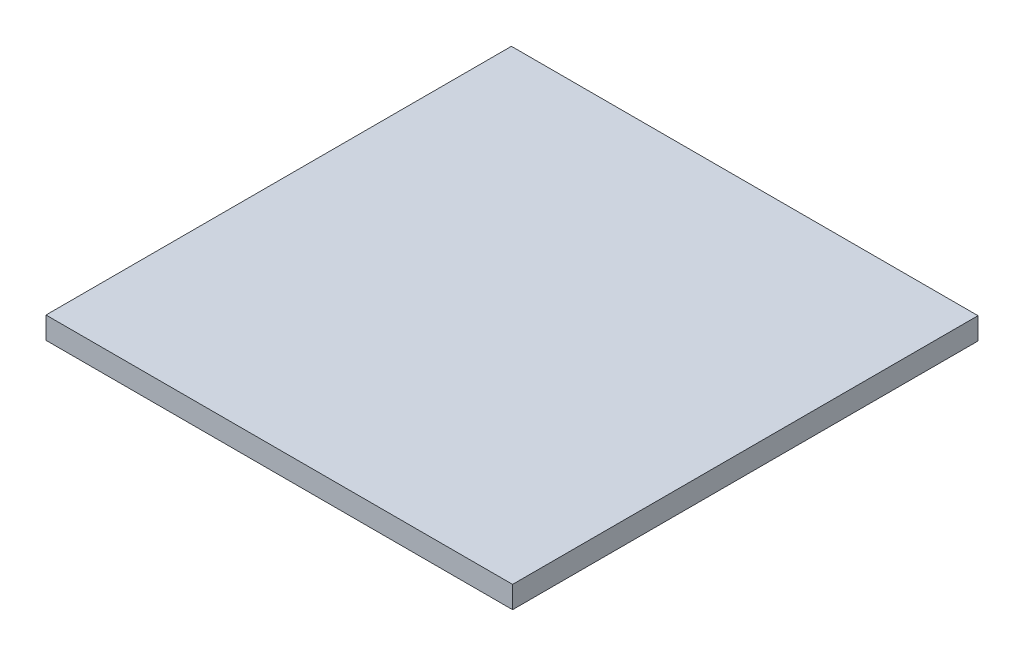
ISO-10303-21;
HEADER;
FILE_DESCRIPTION(('STEP AP214'),'2;1');
FILE_NAME('part.step','',(''),(''),'','','');
FILE_SCHEMA(('AUTOMOTIVE_DESIGN { 1 0 10303 214 1 1 1 1 }'));
ENDSEC;
DATA;
#1=APPLICATION_CONTEXT('core data for automotive mechanical design processes');
#2=APPLICATION_PROTOCOL_DEFINITION('international standard','automotive_design',2000,#1);
#3=PRODUCT_CONTEXT('',#1,'mechanical');
#4=PRODUCT('Part','Part','',(#3));
#5=PRODUCT_RELATED_PRODUCT_CATEGORY('part','',(#4));
#6=PRODUCT_DEFINITION_FORMATION('','',#4);
#7=PRODUCT_DEFINITION_CONTEXT('part definition',#1,'design');
#8=PRODUCT_DEFINITION('design','',#6,#7);
#9=PRODUCT_DEFINITION_SHAPE('','',#8);
#10=(LENGTH_UNIT() NAMED_UNIT(*) SI_UNIT(.MILLI.,.METRE.));
#11=(NAMED_UNIT(*) PLANE_ANGLE_UNIT() SI_UNIT($,.RADIAN.));
#12=(NAMED_UNIT(*) SI_UNIT($,.STERADIAN.) SOLID_ANGLE_UNIT());
#13=UNCERTAINTY_MEASURE_WITH_UNIT(LENGTH_MEASURE(1.E-05),#10,'distance_accuracy_value','');
#14=(GEOMETRIC_REPRESENTATION_CONTEXT(3) GLOBAL_UNCERTAINTY_ASSIGNED_CONTEXT((#13)) GLOBAL_UNIT_ASSIGNED_CONTEXT((#10,
#11,#12)) REPRESENTATION_CONTEXT('',''));
#15=CARTESIAN_POINT('',(0.,0.,0.));
#16=DIRECTION('',(0.,0.,1.));
#17=DIRECTION('',(1.,0.,0.));
#18=AXIS2_PLACEMENT_3D('',#15,#16,#17);
#19=CARTESIAN_POINT('',(0.,30.,-636.));
#20=DIRECTION('',(0.,0.,1.));
#21=DIRECTION('',(1.,0.,0.));
#22=AXIS2_PLACEMENT_3D('',#19,#20,#21);
#23=PLANE('',#22);
#24=DIRECTION('',(-1.,0.,0.));
#25=VECTOR('',#24,1.);
#26=CARTESIAN_POINT('',(0.,0.,-636.));
#27=LINE('',#26,#25);
#28=CARTESIAN_POINT('',(0.,0.,-636.));
#29=VERTEX_POINT('',#28);
#30=CARTESIAN_POINT('',(-637.6,0.,-636.));
#31=VERTEX_POINT('',#30);
#32=EDGE_CURVE('E99',#29,#31,#27,.T.);
#33=ORIENTED_EDGE('',*,*,#32,.T.);
#34=DIRECTION('',(0.,-1.,0.));
#35=VECTOR('',#34,1.);
#36=CARTESIAN_POINT('',(-637.6,30.,-636.));
#37=LINE('',#36,#35);
#38=CARTESIAN_POINT('',(-637.6,30.,-636.));
#39=VERTEX_POINT('',#38);
#40=EDGE_CURVE('E11',#39,#31,#37,.T.);
#41=ORIENTED_EDGE('',*,*,#40,.F.);
#42=DIRECTION('',(-1.,0.,0.));
#43=VECTOR('',#42,1.);
#44=CARTESIAN_POINT('',(0.,30.,-636.));
#45=LINE('',#44,#43);
#46=CARTESIAN_POINT('',(0.,30.,-636.));
#47=VERTEX_POINT('',#46);
#48=EDGE_CURVE('E76',#47,#39,#45,.T.);
#49=ORIENTED_EDGE('',*,*,#48,.F.);
#50=DIRECTION('',(0.,-1.,0.));
#51=VECTOR('',#50,1.);
#52=CARTESIAN_POINT('',(0.,30.,-636.));
#53=LINE('',#52,#51);
#54=EDGE_CURVE('E95',#47,#29,#53,.T.);
#55=ORIENTED_EDGE('',*,*,#54,.T.);
#56=EDGE_LOOP('',(#33,#41,#49,#55));
#57=FACE_BOUND('',#56,.T.);
#58=ADVANCED_FACE('F37',(#57),#23,.F.);
#59=CARTESIAN_POINT('',(-637.6,30.,0.));
#60=DIRECTION('',(-1.,0.,0.));
#61=DIRECTION('',(0.,0.,1.));
#62=AXIS2_PLACEMENT_3D('',#59,#60,#61);
#63=PLANE('',#62);
#64=DIRECTION('',(0.,0.,-1.));
#65=VECTOR('',#64,1.);
#66=CARTESIAN_POINT('',(-637.6,0.,0.));
#67=LINE('',#66,#65);
#68=CARTESIAN_POINT('',(-637.6,0.,0.));
#69=VERTEX_POINT('',#68);
#70=EDGE_CURVE('E85',#69,#31,#67,.T.);
#71=ORIENTED_EDGE('',*,*,#70,.F.);
#72=DIRECTION('',(0.,-1.,0.));
#73=VECTOR('',#72,1.);
#74=CARTESIAN_POINT('',(-637.6,30.,0.));
#75=LINE('',#74,#73);
#76=CARTESIAN_POINT('',(-637.6,30.,0.));
#77=VERTEX_POINT('',#76);
#78=EDGE_CURVE('E45',#77,#69,#75,.T.);
#79=ORIENTED_EDGE('',*,*,#78,.F.);
#80=DIRECTION('',(0.,0.,-1.));
#81=VECTOR('',#80,1.);
#82=CARTESIAN_POINT('',(-637.6,30.,0.));
#83=LINE('',#82,#81);
#84=EDGE_CURVE('E83',#77,#39,#83,.T.);
#85=ORIENTED_EDGE('',*,*,#84,.T.);
#86=ORIENTED_EDGE('',*,*,#40,.T.);
#87=EDGE_LOOP('',(#71,#79,#85,#86));
#88=FACE_BOUND('',#87,.T.);
#89=ADVANCED_FACE('F82',(#88),#63,.T.);
#90=CARTESIAN_POINT('',(0.,30.,0.));
#91=DIRECTION('',(0.,0.,1.));
#92=DIRECTION('',(1.,0.,0.));
#93=AXIS2_PLACEMENT_3D('',#90,#91,#92);
#94=PLANE('',#93);
#95=DIRECTION('',(-1.,0.,0.));
#96=VECTOR('',#95,1.);
#97=CARTESIAN_POINT('',(0.,0.,0.));
#98=LINE('',#97,#96);
#99=CARTESIAN_POINT('',(0.,0.,0.));
#100=VERTEX_POINT('',#99);
#101=EDGE_CURVE('E103',#100,#69,#98,.T.);
#102=ORIENTED_EDGE('',*,*,#101,.F.);
#103=DIRECTION('',(0.,-1.,0.));
#104=VECTOR('',#103,1.);
#105=CARTESIAN_POINT('',(0.,30.,0.));
#106=LINE('',#105,#104);
#107=CARTESIAN_POINT('',(0.,30.,0.));
#108=VERTEX_POINT('',#107);
#109=EDGE_CURVE('E68',#108,#100,#106,.T.);
#110=ORIENTED_EDGE('',*,*,#109,.F.);
#111=DIRECTION('',(-1.,0.,0.));
#112=VECTOR('',#111,1.);
#113=CARTESIAN_POINT('',(0.,30.,0.));
#114=LINE('',#113,#112);
#115=EDGE_CURVE('E91',#108,#77,#114,.T.);
#116=ORIENTED_EDGE('',*,*,#115,.T.);
#117=ORIENTED_EDGE('',*,*,#78,.T.);
#118=EDGE_LOOP('',(#102,#110,#116,#117));
#119=FACE_BOUND('',#118,.T.);
#120=ADVANCED_FACE('F93',(#119),#94,.T.);
#121=CARTESIAN_POINT('',(0.,30.,0.));
#122=DIRECTION('',(-1.,0.,0.));
#123=DIRECTION('',(0.,0.,1.));
#124=AXIS2_PLACEMENT_3D('',#121,#122,#123);
#125=PLANE('',#124);
#126=DIRECTION('',(0.,0.,-1.));
#127=VECTOR('',#126,1.);
#128=CARTESIAN_POINT('',(0.,0.,0.));
#129=LINE('',#128,#127);
#130=EDGE_CURVE('E71',#100,#29,#129,.T.);
#131=ORIENTED_EDGE('',*,*,#130,.T.);
#132=ORIENTED_EDGE('',*,*,#54,.F.);
#133=DIRECTION('',(0.,0.,-1.));
#134=VECTOR('',#133,1.);
#135=CARTESIAN_POINT('',(0.,30.,0.));
#136=LINE('',#135,#134);
#137=EDGE_CURVE('E53',#108,#47,#136,.T.);
#138=ORIENTED_EDGE('',*,*,#137,.F.);
#139=ORIENTED_EDGE('',*,*,#109,.T.);
#140=EDGE_LOOP('',(#131,#132,#138,#139));
#141=FACE_BOUND('',#140,.T.);
#142=ADVANCED_FACE('F116',(#141),#125,.F.);
#143=CARTESIAN_POINT('',(0.,30.,0.));
#144=DIRECTION('',(0.,-1.,0.));
#145=DIRECTION('',(0.,0.,-1.));
#146=AXIS2_PLACEMENT_3D('',#143,#144,#145);
#147=PLANE('',#146);
#148=ORIENTED_EDGE('',*,*,#48,.T.);
#149=ORIENTED_EDGE('',*,*,#84,.F.);
#150=ORIENTED_EDGE('',*,*,#115,.F.);
#151=ORIENTED_EDGE('',*,*,#137,.T.);
#152=EDGE_LOOP('',(#148,#149,#150,#151));
#153=FACE_BOUND('',#152,.T.);
#154=ADVANCED_FACE('F90',(#153),#147,.F.);
#155=CARTESIAN_POINT('',(0.,0.,0.));
#156=DIRECTION('',(0.,-1.,0.));
#157=DIRECTION('',(0.,0.,-1.));
#158=AXIS2_PLACEMENT_3D('',#155,#156,#157);
#159=PLANE('',#158);
#160=ORIENTED_EDGE('',*,*,#32,.F.);
#161=ORIENTED_EDGE('',*,*,#130,.F.);
#162=ORIENTED_EDGE('',*,*,#101,.T.);
#163=ORIENTED_EDGE('',*,*,#70,.T.);
#164=EDGE_LOOP('',(#160,#161,#162,#163));
#165=FACE_BOUND('',#164,.T.);
#166=ADVANCED_FACE('F110',(#165),#159,.T.);
#167=CLOSED_SHELL('',(#58,#89,#120,#142,#154,#166));
#168=MANIFOLD_SOLID_BREP('B2',#167);
#169=ADVANCED_BREP_SHAPE_REPRESENTATION('',(#18,#168),#14);
#170=SHAPE_DEFINITION_REPRESENTATION(#9,#169);
ENDSEC;
END-ISO-10303-21;
